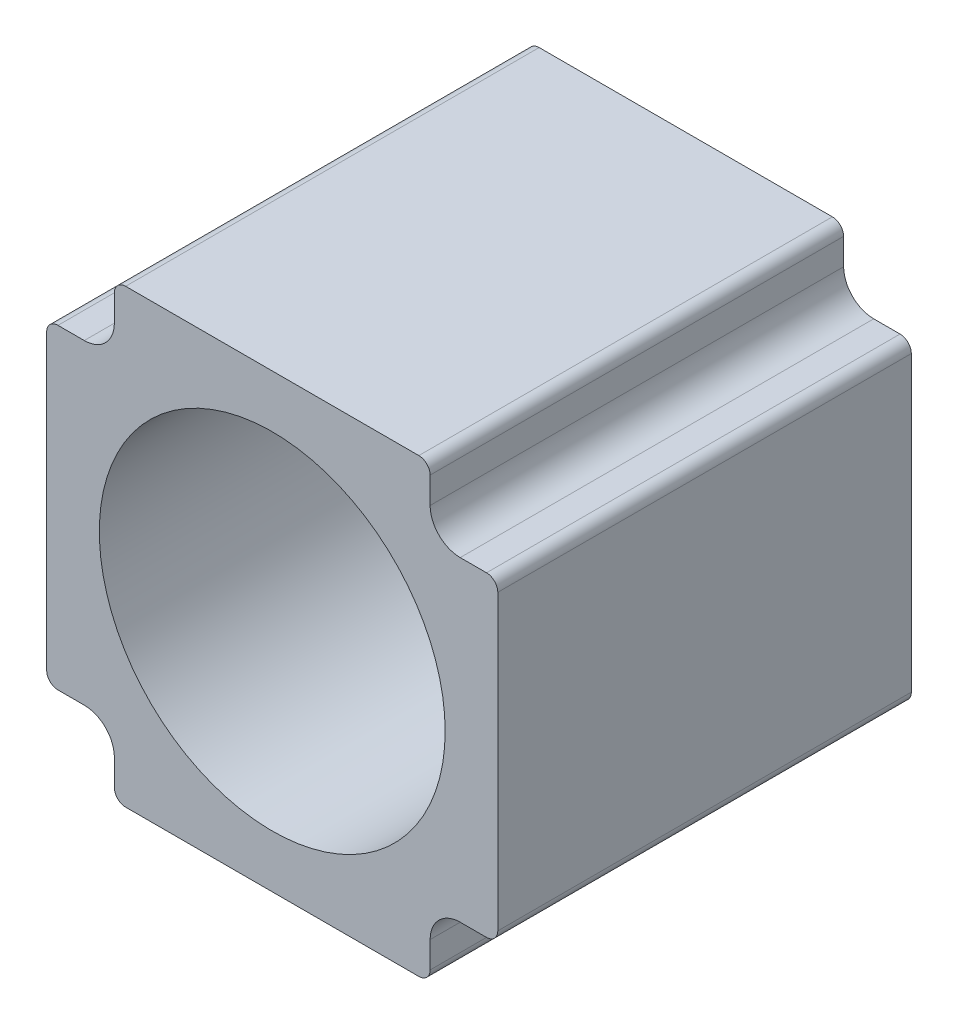
ISO-10303-21;
HEADER;
FILE_DESCRIPTION(('STEP AP214'),'2;1');
FILE_NAME('part.step','',(''),(''),'','','');
FILE_SCHEMA(('AUTOMOTIVE_DESIGN { 1 0 10303 214 1 1 1 1 }'));
ENDSEC;
DATA;
#1=APPLICATION_CONTEXT('core data for automotive mechanical design processes');
#2=APPLICATION_PROTOCOL_DEFINITION('international standard','automotive_design',2000,#1);
#3=PRODUCT_CONTEXT('',#1,'mechanical');
#4=PRODUCT('Part','Part','',(#3));
#5=PRODUCT_RELATED_PRODUCT_CATEGORY('part','',(#4));
#6=PRODUCT_DEFINITION_FORMATION('','',#4);
#7=PRODUCT_DEFINITION_CONTEXT('part definition',#1,'design');
#8=PRODUCT_DEFINITION('design','',#6,#7);
#9=PRODUCT_DEFINITION_SHAPE('','',#8);
#10=(LENGTH_UNIT() NAMED_UNIT(*) SI_UNIT(.MILLI.,.METRE.));
#11=(NAMED_UNIT(*) PLANE_ANGLE_UNIT() SI_UNIT($,.RADIAN.));
#12=(NAMED_UNIT(*) SI_UNIT($,.STERADIAN.) SOLID_ANGLE_UNIT());
#13=UNCERTAINTY_MEASURE_WITH_UNIT(LENGTH_MEASURE(1.E-05),#10,'distance_accuracy_value','');
#14=(GEOMETRIC_REPRESENTATION_CONTEXT(3) GLOBAL_UNCERTAINTY_ASSIGNED_CONTEXT((#13)) GLOBAL_UNIT_ASSIGNED_CONTEXT((#10,
#11,#12)) REPRESENTATION_CONTEXT('',''));
#15=CARTESIAN_POINT('',(0.,0.,0.));
#16=DIRECTION('',(0.,0.,1.));
#17=DIRECTION('',(1.,0.,0.));
#18=AXIS2_PLACEMENT_3D('',#15,#16,#17);
#19=CARTESIAN_POINT('',(78.3,-39.,90.75));
#20=DIRECTION('',(-1.,0.,0.));
#21=DIRECTION('',(0.,0.,1.));
#22=AXIS2_PLACEMENT_3D('',#19,#20,#21);
#23=PLANE('',#22);
#24=DIRECTION('',(0.,1.,0.));
#25=VECTOR('',#24,1.);
#26=CARTESIAN_POINT('',(78.3,-39.,90.75));
#27=LINE('',#26,#25);
#28=CARTESIAN_POINT('',(78.3,-35.55,90.75));
#29=VERTEX_POINT('',#28);
#30=CARTESIAN_POINT('',(78.3,-27.5,90.75));
#31=VERTEX_POINT('',#30);
#32=EDGE_CURVE('E239',#29,#31,#27,.T.);
#33=ORIENTED_EDGE('',*,*,#32,.F.);
#34=DIRECTION('',(0.,0.,-1.));
#35=VECTOR('',#34,1.);
#36=CARTESIAN_POINT('',(78.3,-35.55,90.75));
#37=LINE('',#36,#35);
#38=CARTESIAN_POINT('',(78.3,-35.55,-35.75));
#39=VERTEX_POINT('',#38);
#40=EDGE_CURVE('E42',#29,#39,#37,.T.);
#41=ORIENTED_EDGE('',*,*,#40,.T.);
#42=DIRECTION('',(0.,1.,0.));
#43=VECTOR('',#42,1.);
#44=CARTESIAN_POINT('',(78.3,-39.,-35.75));
#45=LINE('',#44,#43);
#46=CARTESIAN_POINT('',(78.3,-27.5,-35.75));
#47=VERTEX_POINT('',#46);
#48=EDGE_CURVE('E343',#39,#47,#45,.T.);
#49=ORIENTED_EDGE('',*,*,#48,.T.);
#50=DIRECTION('',(0.,0.,-1.));
#51=VECTOR('',#50,1.);
#52=CARTESIAN_POINT('',(78.3,-27.5,90.75));
#53=LINE('',#52,#51);
#54=EDGE_CURVE('E251',#47,#31,#53,.F.);
#55=ORIENTED_EDGE('',*,*,#54,.T.);
#56=EDGE_LOOP('',(#33,#41,#49,#55));
#57=FACE_BOUND('',#56,.T.);
#58=ADVANCED_FACE('F34',(#57),#23,.F.);
#59=CARTESIAN_POINT('',(99.,-18.3,90.75));
#60=DIRECTION('',(0.,1.,0.));
#61=DIRECTION('',(0.,0.,1.));
#62=AXIS2_PLACEMENT_3D('',#59,#60,#61);
#63=PLANE('',#62);
#64=DIRECTION('',(1.,0.,0.));
#65=VECTOR('',#64,1.);
#66=CARTESIAN_POINT('',(99.,-18.3,-35.75));
#67=LINE('',#66,#65);
#68=CARTESIAN_POINT('',(87.5,-18.3,-35.75));
#69=VERTEX_POINT('',#68);
#70=CARTESIAN_POINT('',(95.55,-18.3,-35.75));
#71=VERTEX_POINT('',#70);
#72=EDGE_CURVE('E349',#69,#71,#67,.T.);
#73=ORIENTED_EDGE('',*,*,#72,.T.);
#74=DIRECTION('',(0.,0.,-1.));
#75=VECTOR('',#74,1.);
#76=CARTESIAN_POINT('',(95.55,-18.3,90.75));
#77=LINE('',#76,#75);
#78=CARTESIAN_POINT('',(95.55,-18.3,90.75));
#79=VERTEX_POINT('',#78);
#80=EDGE_CURVE('E11',#71,#79,#77,.F.);
#81=ORIENTED_EDGE('',*,*,#80,.T.);
#82=DIRECTION('',(1.,0.,0.));
#83=VECTOR('',#82,1.);
#84=CARTESIAN_POINT('',(99.,-18.3,90.75));
#85=LINE('',#84,#83);
#86=CARTESIAN_POINT('',(87.5,-18.3,90.75));
#87=VERTEX_POINT('',#86);
#88=EDGE_CURVE('E512',#87,#79,#85,.T.);
#89=ORIENTED_EDGE('',*,*,#88,.F.);
#90=DIRECTION('',(0.,0.,-1.));
#91=VECTOR('',#90,1.);
#92=CARTESIAN_POINT('',(87.5,-18.3,-35.75));
#93=LINE('',#92,#91);
#94=EDGE_CURVE('E248',#87,#69,#93,.T.);
#95=ORIENTED_EDGE('',*,*,#94,.T.);
#96=EDGE_LOOP('',(#73,#81,#89,#95));
#97=FACE_BOUND('',#96,.T.);
#98=ADVANCED_FACE('F412',(#97),#63,.F.);
#99=CARTESIAN_POINT('',(99.,-18.3,90.75));
#100=DIRECTION('',(-1.,0.,0.));
#101=DIRECTION('',(0.,0.,1.));
#102=AXIS2_PLACEMENT_3D('',#99,#100,#101);
#103=PLANE('',#102);
#104=DIRECTION('',(0.,1.,0.));
#105=VECTOR('',#104,1.);
#106=CARTESIAN_POINT('',(99.,-18.3,-35.75));
#107=LINE('',#106,#105);
#108=CARTESIAN_POINT('',(99.,-14.85,-35.75));
#109=VERTEX_POINT('',#108);
#110=CARTESIAN_POINT('',(99.,74.85,-35.75));
#111=VERTEX_POINT('',#110);
#112=EDGE_CURVE('E353',#109,#111,#107,.T.);
#113=ORIENTED_EDGE('',*,*,#112,.T.);
#114=DIRECTION('',(0.,0.,-1.));
#115=VECTOR('',#114,1.);
#116=CARTESIAN_POINT('',(99.,74.85,90.75));
#117=LINE('',#116,#115);
#118=CARTESIAN_POINT('',(99.,74.85,90.75));
#119=VERTEX_POINT('',#118);
#120=EDGE_CURVE('E296',#111,#119,#117,.F.);
#121=ORIENTED_EDGE('',*,*,#120,.T.);
#122=DIRECTION('',(0.,1.,0.));
#123=VECTOR('',#122,1.);
#124=CARTESIAN_POINT('',(99.,-18.3,90.75));
#125=LINE('',#124,#123);
#126=CARTESIAN_POINT('',(99.,-14.85,90.75));
#127=VERTEX_POINT('',#126);
#128=EDGE_CURVE('E507',#127,#119,#125,.T.);
#129=ORIENTED_EDGE('',*,*,#128,.F.);
#130=DIRECTION('',(0.,0.,-1.));
#131=VECTOR('',#130,1.);
#132=CARTESIAN_POINT('',(99.,-14.85,90.75));
#133=LINE('',#132,#131);
#134=EDGE_CURVE('E293',#127,#109,#133,.T.);
#135=ORIENTED_EDGE('',*,*,#134,.T.);
#136=EDGE_LOOP('',(#113,#121,#129,#135));
#137=FACE_BOUND('',#136,.T.);
#138=ADVANCED_FACE('F417',(#137),#103,.F.);
#139=CARTESIAN_POINT('',(78.3,78.3,90.75));
#140=DIRECTION('',(0.,-1.,0.));
#141=DIRECTION('',(0.,0.,-1.));
#142=AXIS2_PLACEMENT_3D('',#139,#140,#141);
#143=PLANE('',#142);
#144=DIRECTION('',(-1.,0.,0.));
#145=VECTOR('',#144,1.);
#146=CARTESIAN_POINT('',(78.3,78.3,90.75));
#147=LINE('',#146,#145);
#148=CARTESIAN_POINT('',(95.55,78.3,90.75));
#149=VERTEX_POINT('',#148);
#150=CARTESIAN_POINT('',(87.5,78.3,90.75));
#151=VERTEX_POINT('',#150);
#152=EDGE_CURVE('E506',#149,#151,#147,.T.);
#153=ORIENTED_EDGE('',*,*,#152,.F.);
#154=DIRECTION('',(0.,0.,-1.));
#155=VECTOR('',#154,1.);
#156=CARTESIAN_POINT('',(95.55,78.3,90.75));
#157=LINE('',#156,#155);
#158=CARTESIAN_POINT('',(95.55,78.3,-35.75));
#159=VERTEX_POINT('',#158);
#160=EDGE_CURVE('E275',#149,#159,#157,.T.);
#161=ORIENTED_EDGE('',*,*,#160,.T.);
#162=DIRECTION('',(-1.,0.,0.));
#163=VECTOR('',#162,1.);
#164=CARTESIAN_POINT('',(78.3,78.3,-35.75));
#165=LINE('',#164,#163);
#166=CARTESIAN_POINT('',(87.5,78.3,-35.75));
#167=VERTEX_POINT('',#166);
#168=EDGE_CURVE('E363',#159,#167,#165,.T.);
#169=ORIENTED_EDGE('',*,*,#168,.T.);
#170=DIRECTION('',(0.,0.,-1.));
#171=VECTOR('',#170,1.);
#172=CARTESIAN_POINT('',(87.5,78.3,90.75));
#173=LINE('',#172,#171);
#174=EDGE_CURVE('E208',#167,#151,#173,.F.);
#175=ORIENTED_EDGE('',*,*,#174,.T.);
#176=EDGE_LOOP('',(#153,#161,#169,#175));
#177=FACE_BOUND('',#176,.T.);
#178=ADVANCED_FACE('F491',(#177),#143,.F.);
#179=CARTESIAN_POINT('',(78.3,99.,90.75));
#180=DIRECTION('',(-1.,0.,0.));
#181=DIRECTION('',(0.,-1.,0.));
#182=AXIS2_PLACEMENT_3D('',#179,#180,#181);
#183=PLANE('',#182);
#184=DIRECTION('',(0.,1.,0.));
#185=VECTOR('',#184,1.);
#186=CARTESIAN_POINT('',(78.3,99.,-35.75));
#187=LINE('',#186,#185);
#188=CARTESIAN_POINT('',(78.3,87.5,-35.75));
#189=VERTEX_POINT('',#188);
#190=CARTESIAN_POINT('',(78.3,95.55,-35.75));
#191=VERTEX_POINT('',#190);
#192=EDGE_CURVE('E365',#189,#191,#187,.T.);
#193=ORIENTED_EDGE('',*,*,#192,.T.);
#194=DIRECTION('',(0.,0.,-1.));
#195=VECTOR('',#194,1.);
#196=CARTESIAN_POINT('',(78.3,95.55,90.75));
#197=LINE('',#196,#195);
#198=CARTESIAN_POINT('',(78.3,95.55,90.75));
#199=VERTEX_POINT('',#198);
#200=EDGE_CURVE('E318',#191,#199,#197,.F.);
#201=ORIENTED_EDGE('',*,*,#200,.T.);
#202=DIRECTION('',(0.,1.,0.));
#203=VECTOR('',#202,1.);
#204=CARTESIAN_POINT('',(78.3,99.,90.75));
#205=LINE('',#204,#203);
#206=CARTESIAN_POINT('',(78.3,87.5,90.75));
#207=VERTEX_POINT('',#206);
#208=EDGE_CURVE('E389',#207,#199,#205,.T.);
#209=ORIENTED_EDGE('',*,*,#208,.F.);
#210=DIRECTION('',(0.,0.,-1.));
#211=VECTOR('',#210,1.);
#212=CARTESIAN_POINT('',(78.3,87.5,-35.75));
#213=LINE('',#212,#211);
#214=EDGE_CURVE('E254',#207,#189,#213,.T.);
#215=ORIENTED_EDGE('',*,*,#214,.T.);
#216=EDGE_LOOP('',(#193,#201,#209,#215));
#217=FACE_BOUND('',#216,.T.);
#218=ADVANCED_FACE('F488',(#217),#183,.F.);
#219=CARTESIAN_POINT('',(-18.3,99.,90.75));
#220=DIRECTION('',(0.,-1.,0.));
#221=DIRECTION('',(0.,0.,-1.));
#222=AXIS2_PLACEMENT_3D('',#219,#220,#221);
#223=PLANE('',#222);
#224=DIRECTION('',(-1.,0.,0.));
#225=VECTOR('',#224,1.);
#226=CARTESIAN_POINT('',(-18.3,99.,90.75));
#227=LINE('',#226,#225);
#228=CARTESIAN_POINT('',(74.85,99.,90.75));
#229=VERTEX_POINT('',#228);
#230=CARTESIAN_POINT('',(-14.85,99.,90.75));
#231=VERTEX_POINT('',#230);
#232=EDGE_CURVE('E383',#229,#231,#227,.T.);
#233=ORIENTED_EDGE('',*,*,#232,.F.);
#234=DIRECTION('',(0.,0.,-1.));
#235=VECTOR('',#234,1.);
#236=CARTESIAN_POINT('',(74.85,99.,90.75));
#237=LINE('',#236,#235);
#238=CARTESIAN_POINT('',(74.85,99.,-35.75));
#239=VERTEX_POINT('',#238);
#240=EDGE_CURVE('E315',#229,#239,#237,.T.);
#241=ORIENTED_EDGE('',*,*,#240,.T.);
#242=DIRECTION('',(-1.,0.,0.));
#243=VECTOR('',#242,1.);
#244=CARTESIAN_POINT('',(-18.3,99.,-35.75));
#245=LINE('',#244,#243);
#246=CARTESIAN_POINT('',(-14.85,99.,-35.75));
#247=VERTEX_POINT('',#246);
#248=EDGE_CURVE('E230',#239,#247,#245,.T.);
#249=ORIENTED_EDGE('',*,*,#248,.T.);
#250=DIRECTION('',(0.,0.,-1.));
#251=VECTOR('',#250,1.);
#252=CARTESIAN_POINT('',(-14.85,99.,90.75));
#253=LINE('',#252,#251);
#254=EDGE_CURVE('E313',#247,#231,#253,.F.);
#255=ORIENTED_EDGE('',*,*,#254,.T.);
#256=EDGE_LOOP('',(#233,#241,#249,#255));
#257=FACE_BOUND('',#256,.T.);
#258=ADVANCED_FACE('F372',(#257),#223,.F.);
#259=CARTESIAN_POINT('',(-18.3,99.,90.75));
#260=DIRECTION('',(1.,0.,0.));
#261=DIRECTION('',(0.,1.,0.));
#262=AXIS2_PLACEMENT_3D('',#259,#260,#261);
#263=PLANE('',#262);
#264=DIRECTION('',(0.,-1.,0.));
#265=VECTOR('',#264,1.);
#266=CARTESIAN_POINT('',(-18.3,99.,90.75));
#267=LINE('',#266,#265);
#268=CARTESIAN_POINT('',(-18.3,95.55,90.75));
#269=VERTEX_POINT('',#268);
#270=CARTESIAN_POINT('',(-18.3,87.5,90.75));
#271=VERTEX_POINT('',#270);
#272=EDGE_CURVE('E382',#269,#271,#267,.T.);
#273=ORIENTED_EDGE('',*,*,#272,.F.);
#274=DIRECTION('',(0.,0.,-1.));
#275=VECTOR('',#274,1.);
#276=CARTESIAN_POINT('',(-18.3,95.55,90.75));
#277=LINE('',#276,#275);
#278=CARTESIAN_POINT('',(-18.3,95.55,-35.75));
#279=VERTEX_POINT('',#278);
#280=EDGE_CURVE('E320',#269,#279,#277,.T.);
#281=ORIENTED_EDGE('',*,*,#280,.T.);
#282=DIRECTION('',(0.,-1.,0.));
#283=VECTOR('',#282,1.);
#284=CARTESIAN_POINT('',(-18.3,99.,-35.75));
#285=LINE('',#284,#283);
#286=CARTESIAN_POINT('',(-18.3,87.5,-35.75));
#287=VERTEX_POINT('',#286);
#288=EDGE_CURVE('E225',#279,#287,#285,.T.);
#289=ORIENTED_EDGE('',*,*,#288,.T.);
#290=DIRECTION('',(0.,0.,-1.));
#291=VECTOR('',#290,1.);
#292=CARTESIAN_POINT('',(-18.3,87.5,90.75));
#293=LINE('',#292,#291);
#294=EDGE_CURVE('E203',#287,#271,#293,.F.);
#295=ORIENTED_EDGE('',*,*,#294,.T.);
#296=EDGE_LOOP('',(#273,#281,#289,#295));
#297=FACE_BOUND('',#296,.T.);
#298=ADVANCED_FACE('F385',(#297),#263,.F.);
#299=CARTESIAN_POINT('',(-39.,78.3,90.75));
#300=DIRECTION('',(0.,-1.,0.));
#301=DIRECTION('',(1.,0.,0.));
#302=AXIS2_PLACEMENT_3D('',#299,#300,#301);
#303=PLANE('',#302);
#304=DIRECTION('',(-1.,0.,0.));
#305=VECTOR('',#304,1.);
#306=CARTESIAN_POINT('',(-39.,78.3,-35.75));
#307=LINE('',#306,#305);
#308=CARTESIAN_POINT('',(-27.5,78.3,-35.75));
#309=VERTEX_POINT('',#308);
#310=CARTESIAN_POINT('',(-35.55,78.3,-35.75));
#311=VERTEX_POINT('',#310);
#312=EDGE_CURVE('E214',#309,#311,#307,.T.);
#313=ORIENTED_EDGE('',*,*,#312,.T.);
#314=DIRECTION('',(0.,0.,-1.));
#315=VECTOR('',#314,1.);
#316=CARTESIAN_POINT('',(-35.55,78.3,90.75));
#317=LINE('',#316,#315);
#318=CARTESIAN_POINT('',(-35.55,78.3,90.75));
#319=VERTEX_POINT('',#318);
#320=EDGE_CURVE('E328',#311,#319,#317,.F.);
#321=ORIENTED_EDGE('',*,*,#320,.T.);
#322=DIRECTION('',(-1.,0.,0.));
#323=VECTOR('',#322,1.);
#324=CARTESIAN_POINT('',(-39.,78.3,90.75));
#325=LINE('',#324,#323);
#326=CARTESIAN_POINT('',(-27.5,78.3,90.75));
#327=VERTEX_POINT('',#326);
#328=EDGE_CURVE('E217',#327,#319,#325,.T.);
#329=ORIENTED_EDGE('',*,*,#328,.F.);
#330=DIRECTION('',(0.,0.,-1.));
#331=VECTOR('',#330,1.);
#332=CARTESIAN_POINT('',(-27.5,78.3,-35.75));
#333=LINE('',#332,#331);
#334=EDGE_CURVE('E201',#327,#309,#333,.T.);
#335=ORIENTED_EDGE('',*,*,#334,.T.);
#336=EDGE_LOOP('',(#313,#321,#329,#335));
#337=FACE_BOUND('',#336,.T.);
#338=ADVANCED_FACE('F213',(#337),#303,.F.);
#339=CARTESIAN_POINT('',(-39.,-18.3,90.75));
#340=DIRECTION('',(1.,0.,0.));
#341=DIRECTION('',(0.,1.,0.));
#342=AXIS2_PLACEMENT_3D('',#339,#340,#341);
#343=PLANE('',#342);
#344=DIRECTION('',(0.,-1.,0.));
#345=VECTOR('',#344,1.);
#346=CARTESIAN_POINT('',(-39.,-18.3,90.75));
#347=LINE('',#346,#345);
#348=CARTESIAN_POINT('',(-39.,74.85,90.75));
#349=VERTEX_POINT('',#348);
#350=CARTESIAN_POINT('',(-39.,-14.85,90.75));
#351=VERTEX_POINT('',#350);
#352=EDGE_CURVE('E387',#349,#351,#347,.T.);
#353=ORIENTED_EDGE('',*,*,#352,.F.);
#354=DIRECTION('',(0.,0.,-1.));
#355=VECTOR('',#354,1.);
#356=CARTESIAN_POINT('',(-39.,74.85,90.75));
#357=LINE('',#356,#355);
#358=CARTESIAN_POINT('',(-39.,74.85,-35.75));
#359=VERTEX_POINT('',#358);
#360=EDGE_CURVE('E325',#349,#359,#357,.T.);
#361=ORIENTED_EDGE('',*,*,#360,.T.);
#362=DIRECTION('',(0.,-1.,0.));
#363=VECTOR('',#362,1.);
#364=CARTESIAN_POINT('',(-39.,-18.3,-35.75));
#365=LINE('',#364,#363);
#366=CARTESIAN_POINT('',(-39.,-14.85,-35.75));
#367=VERTEX_POINT('',#366);
#368=EDGE_CURVE('E224',#359,#367,#365,.T.);
#369=ORIENTED_EDGE('',*,*,#368,.T.);
#370=DIRECTION('',(0.,0.,-1.));
#371=VECTOR('',#370,1.);
#372=CARTESIAN_POINT('',(-39.,-14.85,90.75));
#373=LINE('',#372,#371);
#374=EDGE_CURVE('E323',#367,#351,#373,.F.);
#375=ORIENTED_EDGE('',*,*,#374,.T.);
#376=EDGE_LOOP('',(#353,#361,#369,#375));
#377=FACE_BOUND('',#376,.T.);
#378=ADVANCED_FACE('F471',(#377),#343,.F.);
#379=CARTESIAN_POINT('',(-39.,-18.3,90.75));
#380=DIRECTION('',(0.,1.,0.));
#381=DIRECTION('',(0.,0.,1.));
#382=AXIS2_PLACEMENT_3D('',#379,#380,#381);
#383=PLANE('',#382);
#384=DIRECTION('',(1.,0.,0.));
#385=VECTOR('',#384,1.);
#386=CARTESIAN_POINT('',(-39.,-18.3,90.75));
#387=LINE('',#386,#385);
#388=CARTESIAN_POINT('',(-35.55,-18.3,90.75));
#389=VERTEX_POINT('',#388);
#390=CARTESIAN_POINT('',(-27.5,-18.3,90.75));
#391=VERTEX_POINT('',#390);
#392=EDGE_CURVE('E395',#389,#391,#387,.T.);
#393=ORIENTED_EDGE('',*,*,#392,.F.);
#394=DIRECTION('',(0.,0.,-1.));
#395=VECTOR('',#394,1.);
#396=CARTESIAN_POINT('',(-35.55,-18.3,90.75));
#397=LINE('',#396,#395);
#398=CARTESIAN_POINT('',(-35.55,-18.3,-35.75));
#399=VERTEX_POINT('',#398);
#400=EDGE_CURVE('E330',#389,#399,#397,.T.);
#401=ORIENTED_EDGE('',*,*,#400,.T.);
#402=DIRECTION('',(1.,0.,0.));
#403=VECTOR('',#402,1.);
#404=CARTESIAN_POINT('',(-39.,-18.3,-35.75));
#405=LINE('',#404,#403);
#406=CARTESIAN_POINT('',(-27.5,-18.3,-35.75));
#407=VERTEX_POINT('',#406);
#408=EDGE_CURVE('E228',#399,#407,#405,.T.);
#409=ORIENTED_EDGE('',*,*,#408,.T.);
#410=DIRECTION('',(0.,0.,-1.));
#411=VECTOR('',#410,1.);
#412=CARTESIAN_POINT('',(-27.5,-18.3,90.75));
#413=LINE('',#412,#411);
#414=EDGE_CURVE('E245',#407,#391,#413,.F.);
#415=ORIENTED_EDGE('',*,*,#414,.T.);
#416=EDGE_LOOP('',(#393,#401,#409,#415));
#417=FACE_BOUND('',#416,.T.);
#418=ADVANCED_FACE('F460',(#417),#383,.F.);
#419=CARTESIAN_POINT('',(-18.3,-18.3,90.75));
#420=DIRECTION('',(1.,0.,0.));
#421=DIRECTION('',(0.,1.,0.));
#422=AXIS2_PLACEMENT_3D('',#419,#420,#421);
#423=PLANE('',#422);
#424=DIRECTION('',(0.,-1.,0.));
#425=VECTOR('',#424,1.);
#426=CARTESIAN_POINT('',(-18.3,-18.3,-35.75));
#427=LINE('',#426,#425);
#428=CARTESIAN_POINT('',(-18.3,-27.5,-35.75));
#429=VERTEX_POINT('',#428);
#430=CARTESIAN_POINT('',(-18.3,-35.55,-35.75));
#431=VERTEX_POINT('',#430);
#432=EDGE_CURVE('E235',#429,#431,#427,.T.);
#433=ORIENTED_EDGE('',*,*,#432,.T.);
#434=DIRECTION('',(0.,0.,-1.));
#435=VECTOR('',#434,1.);
#436=CARTESIAN_POINT('',(-18.3,-35.55,90.75));
#437=LINE('',#436,#435);
#438=CARTESIAN_POINT('',(-18.3,-35.55,90.75));
#439=VERTEX_POINT('',#438);
#440=EDGE_CURVE('E337',#431,#439,#437,.F.);
#441=ORIENTED_EDGE('',*,*,#440,.T.);
#442=DIRECTION('',(0.,-1.,0.));
#443=VECTOR('',#442,1.);
#444=CARTESIAN_POINT('',(-18.3,-18.3,90.75));
#445=LINE('',#444,#443);
#446=CARTESIAN_POINT('',(-18.3,-27.5,90.75));
#447=VERTEX_POINT('',#446);
#448=EDGE_CURVE('E396',#447,#439,#445,.T.);
#449=ORIENTED_EDGE('',*,*,#448,.F.);
#450=DIRECTION('',(0.,0.,-1.));
#451=VECTOR('',#450,1.);
#452=CARTESIAN_POINT('',(-18.3,-27.5,-35.75));
#453=LINE('',#452,#451);
#454=EDGE_CURVE('E242',#447,#429,#453,.T.);
#455=ORIENTED_EDGE('',*,*,#454,.T.);
#456=EDGE_LOOP('',(#433,#441,#449,#455));
#457=FACE_BOUND('',#456,.T.);
#458=ADVANCED_FACE('F466',(#457),#423,.F.);
#459=CARTESIAN_POINT('',(-18.3,-39.,90.75));
#460=DIRECTION('',(0.,1.,0.));
#461=DIRECTION('',(0.,0.,1.));
#462=AXIS2_PLACEMENT_3D('',#459,#460,#461);
#463=PLANE('',#462);
#464=DIRECTION('',(1.,0.,0.));
#465=VECTOR('',#464,1.);
#466=CARTESIAN_POINT('',(-18.3,-39.,90.75));
#467=LINE('',#466,#465);
#468=CARTESIAN_POINT('',(-14.85,-39.,90.75));
#469=VERTEX_POINT('',#468);
#470=CARTESIAN_POINT('',(74.85,-39.,90.75));
#471=VERTEX_POINT('',#470);
#472=EDGE_CURVE('E218',#469,#471,#467,.T.);
#473=ORIENTED_EDGE('',*,*,#472,.F.);
#474=DIRECTION('',(0.,0.,-1.));
#475=VECTOR('',#474,1.);
#476=CARTESIAN_POINT('',(-14.85,-39.,90.75));
#477=LINE('',#476,#475);
#478=CARTESIAN_POINT('',(-14.85,-39.,-35.75));
#479=VERTEX_POINT('',#478);
#480=EDGE_CURVE('E334',#469,#479,#477,.T.);
#481=ORIENTED_EDGE('',*,*,#480,.T.);
#482=DIRECTION('',(1.,0.,0.));
#483=VECTOR('',#482,1.);
#484=CARTESIAN_POINT('',(-18.3,-39.,-35.75));
#485=LINE('',#484,#483);
#486=CARTESIAN_POINT('',(74.85,-39.,-35.75));
#487=VERTEX_POINT('',#486);
#488=EDGE_CURVE('E238',#479,#487,#485,.T.);
#489=ORIENTED_EDGE('',*,*,#488,.T.);
#490=DIRECTION('',(0.,0.,-1.));
#491=VECTOR('',#490,1.);
#492=CARTESIAN_POINT('',(74.85,-39.,90.75));
#493=LINE('',#492,#491);
#494=EDGE_CURVE('E49',#487,#471,#493,.F.);
#495=ORIENTED_EDGE('',*,*,#494,.T.);
#496=EDGE_LOOP('',(#473,#481,#489,#495));
#497=FACE_BOUND('',#496,.T.);
#498=ADVANCED_FACE('F469',(#497),#463,.F.);
#499=CARTESIAN_POINT('',(-39.,-39.,90.75));
#500=DIRECTION('',(0.,0.,1.));
#501=DIRECTION('',(1.,0.,0.));
#502=AXIS2_PLACEMENT_3D('',#499,#500,#501);
#503=PLANE('',#502);
#504=CARTESIAN_POINT('',(30.,30.,90.75));
#505=DIRECTION('',(0.,0.,1.));
#506=DIRECTION('',(1.,0.,0.));
#507=AXIS2_PLACEMENT_3D('',#504,#505,#506);
#508=CIRCLE('',#507,52.9);
#509=CARTESIAN_POINT('',(82.9,30.,90.75));
#510=VERTEX_POINT('',#509);
#511=EDGE_CURVE('E356',#510,#510,#508,.T.);
#512=ORIENTED_EDGE('',*,*,#511,.F.);
#513=EDGE_LOOP('',(#512));
#514=FACE_BOUND('',#513,.T.);
#515=ORIENTED_EDGE('',*,*,#128,.T.);
#516=CARTESIAN_POINT('',(95.55,74.85,90.75));
#517=DIRECTION('',(0.,0.,1.));
#518=DIRECTION('',(1.,0.,0.));
#519=AXIS2_PLACEMENT_3D('',#516,#517,#518);
#520=CIRCLE('',#519,3.45);
#521=EDGE_CURVE('E311',#119,#149,#520,.T.);
#522=ORIENTED_EDGE('',*,*,#521,.T.);
#523=ORIENTED_EDGE('',*,*,#152,.T.);
#524=CARTESIAN_POINT('',(87.5,87.5,90.75));
#525=DIRECTION('',(0.,0.,1.));
#526=DIRECTION('',(1.,0.,0.));
#527=AXIS2_PLACEMENT_3D('',#524,#525,#526);
#528=CIRCLE('',#527,9.2);
#529=EDGE_CURVE('E273',#151,#207,#528,.F.);
#530=ORIENTED_EDGE('',*,*,#529,.T.);
#531=ORIENTED_EDGE('',*,*,#208,.T.);
#532=CARTESIAN_POINT('',(74.85,95.55,90.75));
#533=DIRECTION('',(0.,0.,1.));
#534=DIRECTION('',(1.,0.,0.));
#535=AXIS2_PLACEMENT_3D('',#532,#533,#534);
#536=CIRCLE('',#535,3.45);
#537=EDGE_CURVE('E309',#199,#229,#536,.T.);
#538=ORIENTED_EDGE('',*,*,#537,.T.);
#539=ORIENTED_EDGE('',*,*,#232,.T.);
#540=CARTESIAN_POINT('',(-14.85,95.55,90.75));
#541=DIRECTION('',(0.,0.,1.));
#542=DIRECTION('',(1.,0.,0.));
#543=AXIS2_PLACEMENT_3D('',#540,#541,#542);
#544=CIRCLE('',#543,3.45);
#545=EDGE_CURVE('E307',#231,#269,#544,.T.);
#546=ORIENTED_EDGE('',*,*,#545,.T.);
#547=ORIENTED_EDGE('',*,*,#272,.T.);
#548=CARTESIAN_POINT('',(-27.5,87.5,90.75));
#549=DIRECTION('',(0.,0.,1.));
#550=DIRECTION('',(1.,0.,0.));
#551=AXIS2_PLACEMENT_3D('',#548,#549,#550);
#552=CIRCLE('',#551,9.2);
#553=EDGE_CURVE('E207',#271,#327,#552,.F.);
#554=ORIENTED_EDGE('',*,*,#553,.T.);
#555=ORIENTED_EDGE('',*,*,#328,.T.);
#556=CARTESIAN_POINT('',(-35.55,74.85,90.75));
#557=DIRECTION('',(0.,0.,1.));
#558=DIRECTION('',(1.,0.,0.));
#559=AXIS2_PLACEMENT_3D('',#556,#557,#558);
#560=CIRCLE('',#559,3.45);
#561=EDGE_CURVE('E305',#319,#349,#560,.T.);
#562=ORIENTED_EDGE('',*,*,#561,.T.);
#563=ORIENTED_EDGE('',*,*,#352,.T.);
#564=CARTESIAN_POINT('',(-35.55,-14.85,90.75));
#565=DIRECTION('',(0.,0.,1.));
#566=DIRECTION('',(1.,0.,0.));
#567=AXIS2_PLACEMENT_3D('',#564,#565,#566);
#568=CIRCLE('',#567,3.45);
#569=EDGE_CURVE('E303',#351,#389,#568,.T.);
#570=ORIENTED_EDGE('',*,*,#569,.T.);
#571=ORIENTED_EDGE('',*,*,#392,.T.);
#572=CARTESIAN_POINT('',(-27.5,-27.5,90.75));
#573=DIRECTION('',(0.,0.,1.));
#574=DIRECTION('',(1.,0.,0.));
#575=AXIS2_PLACEMENT_3D('',#572,#573,#574);
#576=CIRCLE('',#575,9.2);
#577=EDGE_CURVE('E263',#391,#447,#576,.F.);
#578=ORIENTED_EDGE('',*,*,#577,.T.);
#579=ORIENTED_EDGE('',*,*,#448,.T.);
#580=CARTESIAN_POINT('',(-14.85,-35.55,90.75));
#581=DIRECTION('',(0.,0.,1.));
#582=DIRECTION('',(1.,0.,0.));
#583=AXIS2_PLACEMENT_3D('',#580,#581,#582);
#584=CIRCLE('',#583,3.45);
#585=EDGE_CURVE('E56',#439,#469,#584,.T.);
#586=ORIENTED_EDGE('',*,*,#585,.T.);
#587=ORIENTED_EDGE('',*,*,#472,.T.);
#588=CARTESIAN_POINT('',(74.85,-35.55,90.75));
#589=DIRECTION('',(0.,0.,1.));
#590=DIRECTION('',(1.,0.,0.));
#591=AXIS2_PLACEMENT_3D('',#588,#589,#590);
#592=CIRCLE('',#591,3.45);
#593=EDGE_CURVE('E300',#471,#29,#592,.T.);
#594=ORIENTED_EDGE('',*,*,#593,.T.);
#595=ORIENTED_EDGE('',*,*,#32,.T.);
#596=CARTESIAN_POINT('',(87.5,-27.5,90.75));
#597=DIRECTION('',(0.,0.,1.));
#598=DIRECTION('',(1.,0.,0.));
#599=AXIS2_PLACEMENT_3D('',#596,#597,#598);
#600=CIRCLE('',#599,9.2);
#601=EDGE_CURVE('E268',#31,#87,#600,.F.);
#602=ORIENTED_EDGE('',*,*,#601,.T.);
#603=ORIENTED_EDGE('',*,*,#88,.T.);
#604=CARTESIAN_POINT('',(95.55,-14.85,90.75));
#605=DIRECTION('',(0.,0.,1.));
#606=DIRECTION('',(1.,0.,0.));
#607=AXIS2_PLACEMENT_3D('',#604,#605,#606);
#608=CIRCLE('',#607,3.45);
#609=EDGE_CURVE('E298',#79,#127,#608,.T.);
#610=ORIENTED_EDGE('',*,*,#609,.T.);
#611=EDGE_LOOP('',(#515,#522,#523,#530,#531,#538,#539,#546,#547,#554,#555,#562,#563,#570,#571,
#578,#579,#586,#587,#594,#595,#602,#603,#610));
#612=FACE_BOUND('',#611,.T.);
#613=ADVANCED_FACE('F381',(#514,#612),#503,.T.);
#614=CARTESIAN_POINT('',(-39.,-39.,-35.75));
#615=DIRECTION('',(0.,0.,1.));
#616=DIRECTION('',(1.,0.,0.));
#617=AXIS2_PLACEMENT_3D('',#614,#615,#616);
#618=PLANE('',#617);
#619=CARTESIAN_POINT('',(30.,30.,-35.75));
#620=DIRECTION('',(0.,0.,1.));
#621=DIRECTION('',(1.,0.,0.));
#622=AXIS2_PLACEMENT_3D('',#619,#620,#621);
#623=CIRCLE('',#622,52.9);
#624=CARTESIAN_POINT('',(82.9,30.,-35.75));
#625=VERTEX_POINT('',#624);
#626=EDGE_CURVE('E350',#625,#625,#623,.T.);
#627=ORIENTED_EDGE('',*,*,#626,.T.);
#628=EDGE_LOOP('',(#627));
#629=FACE_BOUND('',#628,.T.);
#630=ORIENTED_EDGE('',*,*,#168,.F.);
#631=CARTESIAN_POINT('',(95.55,74.85,-35.75));
#632=DIRECTION('',(0.,0.,1.));
#633=DIRECTION('',(1.,0.,0.));
#634=AXIS2_PLACEMENT_3D('',#631,#632,#633);
#635=CIRCLE('',#634,3.45);
#636=EDGE_CURVE('E291',#159,#111,#635,.F.);
#637=ORIENTED_EDGE('',*,*,#636,.T.);
#638=ORIENTED_EDGE('',*,*,#112,.F.);
#639=CARTESIAN_POINT('',(95.55,-14.85,-35.75));
#640=DIRECTION('',(0.,0.,1.));
#641=DIRECTION('',(1.,0.,0.));
#642=AXIS2_PLACEMENT_3D('',#639,#640,#641);
#643=CIRCLE('',#642,3.45);
#644=EDGE_CURVE('E278',#109,#71,#643,.F.);
#645=ORIENTED_EDGE('',*,*,#644,.T.);
#646=ORIENTED_EDGE('',*,*,#72,.F.);
#647=CARTESIAN_POINT('',(87.5,-27.5,-35.75));
#648=DIRECTION('',(0.,0.,1.));
#649=DIRECTION('',(1.,0.,0.));
#650=AXIS2_PLACEMENT_3D('',#647,#648,#649);
#651=CIRCLE('',#650,9.2);
#652=EDGE_CURVE('E265',#69,#47,#651,.T.);
#653=ORIENTED_EDGE('',*,*,#652,.T.);
#654=ORIENTED_EDGE('',*,*,#48,.F.);
#655=CARTESIAN_POINT('',(74.85,-35.55,-35.75));
#656=DIRECTION('',(0.,0.,1.));
#657=DIRECTION('',(1.,0.,0.));
#658=AXIS2_PLACEMENT_3D('',#655,#656,#657);
#659=CIRCLE('',#658,3.45);
#660=EDGE_CURVE('E280',#39,#487,#659,.F.);
#661=ORIENTED_EDGE('',*,*,#660,.T.);
#662=ORIENTED_EDGE('',*,*,#488,.F.);
#663=CARTESIAN_POINT('',(-14.85,-35.55,-35.75));
#664=DIRECTION('',(0.,0.,1.));
#665=DIRECTION('',(1.,0.,0.));
#666=AXIS2_PLACEMENT_3D('',#663,#664,#665);
#667=CIRCLE('',#666,3.45);
#668=EDGE_CURVE('E282',#479,#431,#667,.F.);
#669=ORIENTED_EDGE('',*,*,#668,.T.);
#670=ORIENTED_EDGE('',*,*,#432,.F.);
#671=CARTESIAN_POINT('',(-27.5,-27.5,-35.75));
#672=DIRECTION('',(0.,0.,1.));
#673=DIRECTION('',(1.,0.,0.));
#674=AXIS2_PLACEMENT_3D('',#671,#672,#673);
#675=CIRCLE('',#674,9.2);
#676=EDGE_CURVE('E260',#429,#407,#675,.T.);
#677=ORIENTED_EDGE('',*,*,#676,.T.);
#678=ORIENTED_EDGE('',*,*,#408,.F.);
#679=CARTESIAN_POINT('',(-35.55,-14.85,-35.75));
#680=DIRECTION('',(0.,0.,1.));
#681=DIRECTION('',(1.,0.,0.));
#682=AXIS2_PLACEMENT_3D('',#679,#680,#681);
#683=CIRCLE('',#682,3.45);
#684=EDGE_CURVE('E284',#399,#367,#683,.F.);
#685=ORIENTED_EDGE('',*,*,#684,.T.);
#686=ORIENTED_EDGE('',*,*,#368,.F.);
#687=CARTESIAN_POINT('',(-35.55,74.85,-35.75));
#688=DIRECTION('',(0.,0.,1.));
#689=DIRECTION('',(1.,0.,0.));
#690=AXIS2_PLACEMENT_3D('',#687,#688,#689);
#691=CIRCLE('',#690,3.45);
#692=EDGE_CURVE('E223',#359,#311,#691,.F.);
#693=ORIENTED_EDGE('',*,*,#692,.T.);
#694=ORIENTED_EDGE('',*,*,#312,.F.);
#695=CARTESIAN_POINT('',(-27.5,87.5,-35.75));
#696=DIRECTION('',(0.,0.,1.));
#697=DIRECTION('',(1.,0.,0.));
#698=AXIS2_PLACEMENT_3D('',#695,#696,#697);
#699=CIRCLE('',#698,9.2);
#700=EDGE_CURVE('E197',#309,#287,#699,.T.);
#701=ORIENTED_EDGE('',*,*,#700,.T.);
#702=ORIENTED_EDGE('',*,*,#288,.F.);
#703=CARTESIAN_POINT('',(-14.85,95.55,-35.75));
#704=DIRECTION('',(0.,0.,1.));
#705=DIRECTION('',(1.,0.,0.));
#706=AXIS2_PLACEMENT_3D('',#703,#704,#705);
#707=CIRCLE('',#706,3.45);
#708=EDGE_CURVE('E287',#279,#247,#707,.F.);
#709=ORIENTED_EDGE('',*,*,#708,.T.);
#710=ORIENTED_EDGE('',*,*,#248,.F.);
#711=CARTESIAN_POINT('',(74.85,95.55,-35.75));
#712=DIRECTION('',(0.,0.,1.));
#713=DIRECTION('',(1.,0.,0.));
#714=AXIS2_PLACEMENT_3D('',#711,#712,#713);
#715=CIRCLE('',#714,3.45);
#716=EDGE_CURVE('E289',#239,#191,#715,.F.);
#717=ORIENTED_EDGE('',*,*,#716,.T.);
#718=ORIENTED_EDGE('',*,*,#192,.F.);
#719=CARTESIAN_POINT('',(87.5,87.5,-35.75));
#720=DIRECTION('',(0.,0.,1.));
#721=DIRECTION('',(1.,0.,0.));
#722=AXIS2_PLACEMENT_3D('',#719,#720,#721);
#723=CIRCLE('',#722,9.2);
#724=EDGE_CURVE('E270',#189,#167,#723,.T.);
#725=ORIENTED_EDGE('',*,*,#724,.T.);
#726=EDGE_LOOP('',(#630,#637,#638,#645,#646,#653,#654,#661,#662,#669,#670,#677,#678,#685,#686,
#693,#694,#701,#702,#709,#710,#717,#718,#725));
#727=FACE_BOUND('',#726,.T.);
#728=ADVANCED_FACE('F221',(#629,#727),#618,.F.);
#729=CARTESIAN_POINT('',(-27.5,87.5,90.75));
#730=DIRECTION('',(0.,0.,1.));
#731=DIRECTION('',(1.,0.,0.));
#732=AXIS2_PLACEMENT_3D('',#729,#730,#731);
#733=CYLINDRICAL_SURFACE('',#732,9.2);
#734=ORIENTED_EDGE('',*,*,#553,.F.);
#735=ORIENTED_EDGE('',*,*,#294,.F.);
#736=ORIENTED_EDGE('',*,*,#700,.F.);
#737=ORIENTED_EDGE('',*,*,#334,.F.);
#738=EDGE_LOOP('',(#734,#735,#736,#737));
#739=FACE_BOUND('',#738,.T.);
#740=ADVANCED_FACE('F200',(#739),#733,.F.);
#741=CARTESIAN_POINT('',(-27.5,-27.5,90.75));
#742=DIRECTION('',(0.,0.,1.));
#743=DIRECTION('',(1.,0.,0.));
#744=AXIS2_PLACEMENT_3D('',#741,#742,#743);
#745=CYLINDRICAL_SURFACE('',#744,9.2);
#746=ORIENTED_EDGE('',*,*,#577,.F.);
#747=ORIENTED_EDGE('',*,*,#414,.F.);
#748=ORIENTED_EDGE('',*,*,#676,.F.);
#749=ORIENTED_EDGE('',*,*,#454,.F.);
#750=EDGE_LOOP('',(#746,#747,#748,#749));
#751=FACE_BOUND('',#750,.T.);
#752=ADVANCED_FACE('F424',(#751),#745,.F.);
#753=CARTESIAN_POINT('',(87.5,-27.5,90.75));
#754=DIRECTION('',(0.,0.,1.));
#755=DIRECTION('',(1.,0.,0.));
#756=AXIS2_PLACEMENT_3D('',#753,#754,#755);
#757=CYLINDRICAL_SURFACE('',#756,9.2);
#758=ORIENTED_EDGE('',*,*,#601,.F.);
#759=ORIENTED_EDGE('',*,*,#54,.F.);
#760=ORIENTED_EDGE('',*,*,#652,.F.);
#761=ORIENTED_EDGE('',*,*,#94,.F.);
#762=EDGE_LOOP('',(#758,#759,#760,#761));
#763=FACE_BOUND('',#762,.T.);
#764=ADVANCED_FACE('F427',(#763),#757,.F.);
#765=CARTESIAN_POINT('',(87.5,87.5,90.75));
#766=DIRECTION('',(0.,0.,1.));
#767=DIRECTION('',(1.,0.,0.));
#768=AXIS2_PLACEMENT_3D('',#765,#766,#767);
#769=CYLINDRICAL_SURFACE('',#768,9.2);
#770=ORIENTED_EDGE('',*,*,#529,.F.);
#771=ORIENTED_EDGE('',*,*,#174,.F.);
#772=ORIENTED_EDGE('',*,*,#724,.F.);
#773=ORIENTED_EDGE('',*,*,#214,.F.);
#774=EDGE_LOOP('',(#770,#771,#772,#773));
#775=FACE_BOUND('',#774,.T.);
#776=ADVANCED_FACE('F431',(#775),#769,.F.);
#777=CARTESIAN_POINT('',(95.55,74.85,90.75));
#778=DIRECTION('',(0.,0.,-1.));
#779=DIRECTION('',(-1.,0.,0.));
#780=AXIS2_PLACEMENT_3D('',#777,#778,#779);
#781=CYLINDRICAL_SURFACE('',#780,3.45);
#782=ORIENTED_EDGE('',*,*,#521,.F.);
#783=ORIENTED_EDGE('',*,*,#120,.F.);
#784=ORIENTED_EDGE('',*,*,#636,.F.);
#785=ORIENTED_EDGE('',*,*,#160,.F.);
#786=EDGE_LOOP('',(#782,#783,#784,#785));
#787=FACE_BOUND('',#786,.T.);
#788=ADVANCED_FACE('F435',(#787),#781,.T.);
#789=CARTESIAN_POINT('',(74.85,95.55,90.75));
#790=DIRECTION('',(0.,0.,-1.));
#791=DIRECTION('',(-1.,0.,0.));
#792=AXIS2_PLACEMENT_3D('',#789,#790,#791);
#793=CYLINDRICAL_SURFACE('',#792,3.45);
#794=ORIENTED_EDGE('',*,*,#537,.F.);
#795=ORIENTED_EDGE('',*,*,#200,.F.);
#796=ORIENTED_EDGE('',*,*,#716,.F.);
#797=ORIENTED_EDGE('',*,*,#240,.F.);
#798=EDGE_LOOP('',(#794,#795,#796,#797));
#799=FACE_BOUND('',#798,.T.);
#800=ADVANCED_FACE('F439',(#799),#793,.T.);
#801=CARTESIAN_POINT('',(-14.85,95.55,90.75));
#802=DIRECTION('',(0.,0.,-1.));
#803=DIRECTION('',(-1.,0.,0.));
#804=AXIS2_PLACEMENT_3D('',#801,#802,#803);
#805=CYLINDRICAL_SURFACE('',#804,3.45);
#806=ORIENTED_EDGE('',*,*,#545,.F.);
#807=ORIENTED_EDGE('',*,*,#254,.F.);
#808=ORIENTED_EDGE('',*,*,#708,.F.);
#809=ORIENTED_EDGE('',*,*,#280,.F.);
#810=EDGE_LOOP('',(#806,#807,#808,#809));
#811=FACE_BOUND('',#810,.T.);
#812=ADVANCED_FACE('F377',(#811),#805,.T.);
#813=CARTESIAN_POINT('',(-35.55,74.85,90.75));
#814=DIRECTION('',(0.,0.,-1.));
#815=DIRECTION('',(-1.,0.,0.));
#816=AXIS2_PLACEMENT_3D('',#813,#814,#815);
#817=CYLINDRICAL_SURFACE('',#816,3.45);
#818=ORIENTED_EDGE('',*,*,#561,.F.);
#819=ORIENTED_EDGE('',*,*,#320,.F.);
#820=ORIENTED_EDGE('',*,*,#692,.F.);
#821=ORIENTED_EDGE('',*,*,#360,.F.);
#822=EDGE_LOOP('',(#818,#819,#820,#821));
#823=FACE_BOUND('',#822,.T.);
#824=ADVANCED_FACE('F446',(#823),#817,.T.);
#825=CARTESIAN_POINT('',(-35.55,-14.85,90.75));
#826=DIRECTION('',(0.,0.,-1.));
#827=DIRECTION('',(-1.,0.,0.));
#828=AXIS2_PLACEMENT_3D('',#825,#826,#827);
#829=CYLINDRICAL_SURFACE('',#828,3.45);
#830=ORIENTED_EDGE('',*,*,#569,.F.);
#831=ORIENTED_EDGE('',*,*,#374,.F.);
#832=ORIENTED_EDGE('',*,*,#684,.F.);
#833=ORIENTED_EDGE('',*,*,#400,.F.);
#834=EDGE_LOOP('',(#830,#831,#832,#833));
#835=FACE_BOUND('',#834,.T.);
#836=ADVANCED_FACE('F408',(#835),#829,.T.);
#837=CARTESIAN_POINT('',(-14.85,-35.55,90.75));
#838=DIRECTION('',(0.,0.,-1.));
#839=DIRECTION('',(-1.,0.,0.));
#840=AXIS2_PLACEMENT_3D('',#837,#838,#839);
#841=CYLINDRICAL_SURFACE('',#840,3.45);
#842=ORIENTED_EDGE('',*,*,#585,.F.);
#843=ORIENTED_EDGE('',*,*,#440,.F.);
#844=ORIENTED_EDGE('',*,*,#668,.F.);
#845=ORIENTED_EDGE('',*,*,#480,.F.);
#846=EDGE_LOOP('',(#842,#843,#844,#845));
#847=FACE_BOUND('',#846,.T.);
#848=ADVANCED_FACE('F401',(#847),#841,.T.);
#849=CARTESIAN_POINT('',(74.85,-35.55,90.75));
#850=DIRECTION('',(0.,0.,-1.));
#851=DIRECTION('',(-1.,0.,0.));
#852=AXIS2_PLACEMENT_3D('',#849,#850,#851);
#853=CYLINDRICAL_SURFACE('',#852,3.45);
#854=ORIENTED_EDGE('',*,*,#593,.F.);
#855=ORIENTED_EDGE('',*,*,#494,.F.);
#856=ORIENTED_EDGE('',*,*,#660,.F.);
#857=ORIENTED_EDGE('',*,*,#40,.F.);
#858=EDGE_LOOP('',(#854,#855,#856,#857));
#859=FACE_BOUND('',#858,.T.);
#860=ADVANCED_FACE('F399',(#859),#853,.T.);
#861=CARTESIAN_POINT('',(95.55,-14.85,90.75));
#862=DIRECTION('',(0.,0.,-1.));
#863=DIRECTION('',(-1.,0.,0.));
#864=AXIS2_PLACEMENT_3D('',#861,#862,#863);
#865=CYLINDRICAL_SURFACE('',#864,3.45);
#866=ORIENTED_EDGE('',*,*,#609,.F.);
#867=ORIENTED_EDGE('',*,*,#80,.F.);
#868=ORIENTED_EDGE('',*,*,#644,.F.);
#869=ORIENTED_EDGE('',*,*,#134,.F.);
#870=EDGE_LOOP('',(#866,#867,#868,#869));
#871=FACE_BOUND('',#870,.T.);
#872=ADVANCED_FACE('F36',(#871),#865,.T.);
#873=CARTESIAN_POINT('',(30.,30.,-35.75));
#874=DIRECTION('',(0.,0.,1.));
#875=DIRECTION('',(1.,0.,0.));
#876=AXIS2_PLACEMENT_3D('',#873,#874,#875);
#877=CYLINDRICAL_SURFACE('',#876,52.9);
#878=ORIENTED_EDGE('',*,*,#626,.F.);
#879=EDGE_LOOP('',(#878));
#880=FACE_BOUND('',#879,.T.);
#881=ORIENTED_EDGE('',*,*,#511,.T.);
#882=EDGE_LOOP('',(#881));
#883=FACE_BOUND('',#882,.T.);
#884=ADVANCED_FACE('F406',(#880,#883),#877,.F.);
#885=CLOSED_SHELL('',(#58,#98,#138,#178,#218,#258,#298,#338,#378,#418,#458,#498,#613,#728,#740,
#752,#764,#776,#788,#800,#812,#824,#836,#848,#860,#872,#884));
#886=MANIFOLD_SOLID_BREP('B2',#885);
#887=ADVANCED_BREP_SHAPE_REPRESENTATION('',(#18,#886),#14);
#888=SHAPE_DEFINITION_REPRESENTATION(#9,#887);
ENDSEC;
END-ISO-10303-21;
